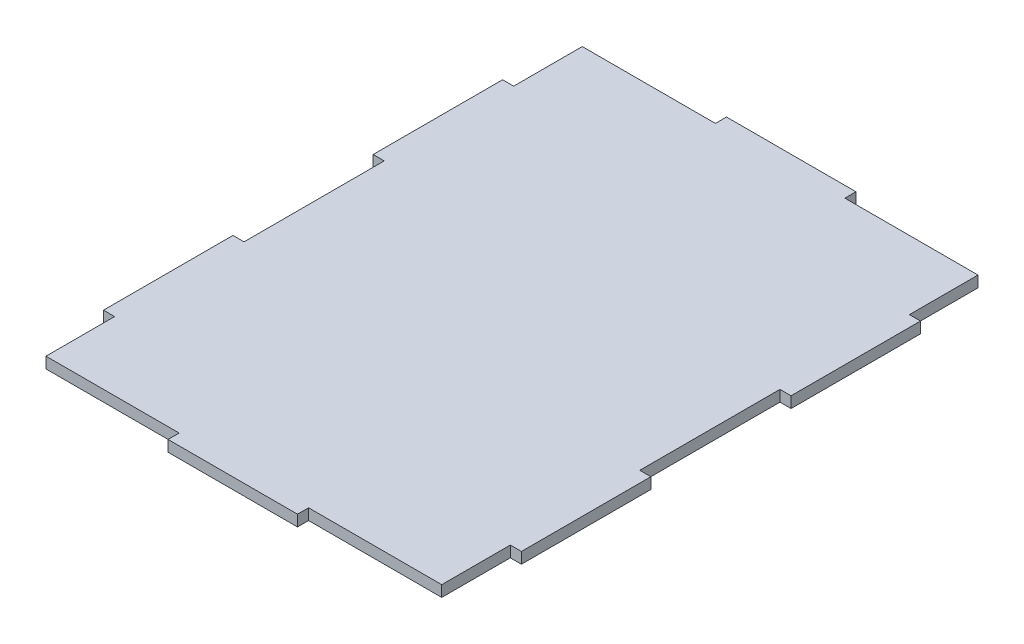
ISO-10303-21;
HEADER;
FILE_DESCRIPTION(('STEP AP214'),'2;1');
FILE_NAME('part.step','',(''),(''),'','','');
FILE_SCHEMA(('AUTOMOTIVE_DESIGN { 1 0 10303 214 1 1 1 1 }'));
ENDSEC;
DATA;
#1=APPLICATION_CONTEXT('core data for automotive mechanical design processes');
#2=APPLICATION_PROTOCOL_DEFINITION('international standard','automotive_design',2000,#1);
#3=PRODUCT_CONTEXT('',#1,'mechanical');
#4=PRODUCT('Part','Part','',(#3));
#5=PRODUCT_RELATED_PRODUCT_CATEGORY('part','',(#4));
#6=PRODUCT_DEFINITION_FORMATION('','',#4);
#7=PRODUCT_DEFINITION_CONTEXT('part definition',#1,'design');
#8=PRODUCT_DEFINITION('design','',#6,#7);
#9=PRODUCT_DEFINITION_SHAPE('','',#8);
#10=(LENGTH_UNIT() NAMED_UNIT(*) SI_UNIT(.MILLI.,.METRE.));
#11=(NAMED_UNIT(*) PLANE_ANGLE_UNIT() SI_UNIT($,.RADIAN.));
#12=(NAMED_UNIT(*) SI_UNIT($,.STERADIAN.) SOLID_ANGLE_UNIT());
#13=UNCERTAINTY_MEASURE_WITH_UNIT(LENGTH_MEASURE(1.E-05),#10,'distance_accuracy_value','');
#14=(GEOMETRIC_REPRESENTATION_CONTEXT(3) GLOBAL_UNCERTAINTY_ASSIGNED_CONTEXT((#13)) GLOBAL_UNIT_ASSIGNED_CONTEXT((#10,
#11,#12)) REPRESENTATION_CONTEXT('',''));
#15=CARTESIAN_POINT('',(0.,0.,0.));
#16=DIRECTION('',(0.,0.,1.));
#17=DIRECTION('',(1.,0.,0.));
#18=AXIS2_PLACEMENT_3D('',#15,#16,#17);
#19=CARTESIAN_POINT('',(56.5,3.,53.9535109118496));
#20=DIRECTION('',(0.,0.,-1.));
#21=DIRECTION('',(-1.,0.,0.));
#22=AXIS2_PLACEMENT_3D('',#19,#20,#21);
#23=PLANE('',#22);
#24=DIRECTION('',(0.,1.,0.));
#25=VECTOR('',#24,1.);
#26=CARTESIAN_POINT('',(53.5,3.,53.9535109118496));
#27=LINE('',#26,#25);
#28=CARTESIAN_POINT('',(53.5,0.,53.9535109118496));
#29=VERTEX_POINT('',#28);
#30=CARTESIAN_POINT('',(53.5,3.,53.9535109118496));
#31=VERTEX_POINT('',#30);
#32=EDGE_CURVE('E11',#29,#31,#27,.T.);
#33=ORIENTED_EDGE('',*,*,#32,.F.);
#34=DIRECTION('',(1.,0.,0.));
#35=VECTOR('',#34,1.);
#36=CARTESIAN_POINT('',(0.,0.,53.9535109118496));
#37=LINE('',#36,#35);
#38=CARTESIAN_POINT('',(56.5,0.,53.9535109118496));
#39=VERTEX_POINT('',#38);
#40=EDGE_CURVE('E168',#39,#29,#37,.F.);
#41=ORIENTED_EDGE('',*,*,#40,.F.);
#42=DIRECTION('',(0.,1.,0.));
#43=VECTOR('',#42,1.);
#44=CARTESIAN_POINT('',(56.5,3.,53.9535109118496));
#45=LINE('',#44,#43);
#46=CARTESIAN_POINT('',(56.5,3.,53.9535109118496));
#47=VERTEX_POINT('',#46);
#48=EDGE_CURVE('E50',#39,#47,#45,.T.);
#49=ORIENTED_EDGE('',*,*,#48,.T.);
#50=DIRECTION('',(-1.,0.,0.));
#51=VECTOR('',#50,1.);
#52=CARTESIAN_POINT('',(56.5,3.,53.9535109118496));
#53=LINE('',#52,#51);
#54=EDGE_CURVE('E326',#47,#31,#53,.T.);
#55=ORIENTED_EDGE('',*,*,#54,.T.);
#56=EDGE_LOOP('',(#33,#41,#49,#55));
#57=FACE_BOUND('',#56,.T.);
#58=ADVANCED_FACE('F41',(#57),#23,.F.);
#59=CARTESIAN_POINT('',(56.5,3.,53.9535109118496));
#60=DIRECTION('',(-1.,0.,0.));
#61=DIRECTION('',(0.,0.,1.));
#62=AXIS2_PLACEMENT_3D('',#59,#60,#61);
#63=PLANE('',#62);
#64=ORIENTED_EDGE('',*,*,#48,.F.);
#65=DIRECTION('',(0.,0.,1.));
#66=VECTOR('',#65,1.);
#67=CARTESIAN_POINT('',(56.5,0.,0.));
#68=LINE('',#67,#66);
#69=CARTESIAN_POINT('',(56.5,0.,18.9535109118496));
#70=VERTEX_POINT('',#69);
#71=EDGE_CURVE('E247',#70,#39,#68,.T.);
#72=ORIENTED_EDGE('',*,*,#71,.F.);
#73=DIRECTION('',(0.,1.,0.));
#74=VECTOR('',#73,1.);
#75=CARTESIAN_POINT('',(56.5,3.,18.9535109118496));
#76=LINE('',#75,#74);
#77=CARTESIAN_POINT('',(56.5,3.,18.9535109118496));
#78=VERTEX_POINT('',#77);
#79=EDGE_CURVE('E319',#70,#78,#76,.T.);
#80=ORIENTED_EDGE('',*,*,#79,.T.);
#81=DIRECTION('',(0.,0.,1.));
#82=VECTOR('',#81,1.);
#83=CARTESIAN_POINT('',(56.5,3.,53.9535109118496));
#84=LINE('',#83,#82);
#85=EDGE_CURVE('E336',#78,#47,#84,.T.);
#86=ORIENTED_EDGE('',*,*,#85,.T.);
#87=EDGE_LOOP('',(#64,#72,#80,#86));
#88=FACE_BOUND('',#87,.T.);
#89=ADVANCED_FACE('F339',(#88),#63,.F.);
#90=CARTESIAN_POINT('',(56.5,3.,18.9535109118496));
#91=DIRECTION('',(0.,0.,-1.));
#92=DIRECTION('',(-1.,0.,0.));
#93=AXIS2_PLACEMENT_3D('',#90,#91,#92);
#94=PLANE('',#93);
#95=ORIENTED_EDGE('',*,*,#79,.F.);
#96=DIRECTION('',(1.,0.,0.));
#97=VECTOR('',#96,1.);
#98=CARTESIAN_POINT('',(0.,0.,18.9535109118496));
#99=LINE('',#98,#97);
#100=CARTESIAN_POINT('',(53.5,0.,18.9535109118496));
#101=VERTEX_POINT('',#100);
#102=EDGE_CURVE('E244',#70,#101,#99,.F.);
#103=ORIENTED_EDGE('',*,*,#102,.T.);
#104=DIRECTION('',(0.,1.,0.));
#105=VECTOR('',#104,1.);
#106=CARTESIAN_POINT('',(53.5,3.,18.9535109118496));
#107=LINE('',#106,#105);
#108=CARTESIAN_POINT('',(53.5,3.,18.9535109118496));
#109=VERTEX_POINT('',#108);
#110=EDGE_CURVE('E316',#101,#109,#107,.T.);
#111=ORIENTED_EDGE('',*,*,#110,.T.);
#112=DIRECTION('',(-1.,0.,0.));
#113=VECTOR('',#112,1.);
#114=CARTESIAN_POINT('',(56.5,3.,18.9535109118496));
#115=LINE('',#114,#113);
#116=EDGE_CURVE('E340',#78,#109,#115,.T.);
#117=ORIENTED_EDGE('',*,*,#116,.F.);
#118=EDGE_LOOP('',(#95,#103,#111,#117));
#119=FACE_BOUND('',#118,.T.);
#120=ADVANCED_FACE('F554',(#119),#94,.T.);
#121=CARTESIAN_POINT('',(53.5,3.,-72.5));
#122=DIRECTION('',(-1.,0.,0.));
#123=DIRECTION('',(0.,0.,1.));
#124=AXIS2_PLACEMENT_3D('',#121,#122,#123);
#125=PLANE('',#124);
#126=ORIENTED_EDGE('',*,*,#110,.F.);
#127=DIRECTION('',(0.,0.,1.));
#128=VECTOR('',#127,1.);
#129=CARTESIAN_POINT('',(53.5,0.,0.));
#130=LINE('',#129,#128);
#131=CARTESIAN_POINT('',(53.5,0.,-18.9535109118496));
#132=VERTEX_POINT('',#131);
#133=EDGE_CURVE('E241',#132,#101,#130,.T.);
#134=ORIENTED_EDGE('',*,*,#133,.F.);
#135=DIRECTION('',(0.,1.,0.));
#136=VECTOR('',#135,1.);
#137=CARTESIAN_POINT('',(53.5,3.,-18.9535109118496));
#138=LINE('',#137,#136);
#139=CARTESIAN_POINT('',(53.5,3.,-18.9535109118496));
#140=VERTEX_POINT('',#139);
#141=EDGE_CURVE('E313',#132,#140,#138,.T.);
#142=ORIENTED_EDGE('',*,*,#141,.T.);
#143=DIRECTION('',(0.,0.,1.));
#144=VECTOR('',#143,1.);
#145=CARTESIAN_POINT('',(53.5,3.,-72.5));
#146=LINE('',#145,#144);
#147=EDGE_CURVE('E342',#140,#109,#146,.T.);
#148=ORIENTED_EDGE('',*,*,#147,.T.);
#149=EDGE_LOOP('',(#126,#134,#142,#148));
#150=FACE_BOUND('',#149,.T.);
#151=ADVANCED_FACE('F423',(#150),#125,.F.);
#152=CARTESIAN_POINT('',(56.5,3.,-18.9535109118496));
#153=DIRECTION('',(0.,0.,-1.));
#154=DIRECTION('',(-1.,0.,0.));
#155=AXIS2_PLACEMENT_3D('',#152,#153,#154);
#156=PLANE('',#155);
#157=ORIENTED_EDGE('',*,*,#141,.F.);
#158=DIRECTION('',(1.,0.,0.));
#159=VECTOR('',#158,1.);
#160=CARTESIAN_POINT('',(0.,0.,-18.9535109118496));
#161=LINE('',#160,#159);
#162=CARTESIAN_POINT('',(56.5,0.,-18.9535109118496));
#163=VERTEX_POINT('',#162);
#164=EDGE_CURVE('E238',#163,#132,#161,.F.);
#165=ORIENTED_EDGE('',*,*,#164,.F.);
#166=DIRECTION('',(0.,1.,0.));
#167=VECTOR('',#166,1.);
#168=CARTESIAN_POINT('',(56.5,3.,-18.9535109118496));
#169=LINE('',#168,#167);
#170=CARTESIAN_POINT('',(56.5,3.,-18.9535109118496));
#171=VERTEX_POINT('',#170);
#172=EDGE_CURVE('E310',#163,#171,#169,.T.);
#173=ORIENTED_EDGE('',*,*,#172,.T.);
#174=DIRECTION('',(-1.,0.,0.));
#175=VECTOR('',#174,1.);
#176=CARTESIAN_POINT('',(56.5,3.,-18.9535109118496));
#177=LINE('',#176,#175);
#178=EDGE_CURVE('E346',#171,#140,#177,.T.);
#179=ORIENTED_EDGE('',*,*,#178,.T.);
#180=EDGE_LOOP('',(#157,#165,#173,#179));
#181=FACE_BOUND('',#180,.T.);
#182=ADVANCED_FACE('F432',(#181),#156,.F.);
#183=CARTESIAN_POINT('',(56.5,3.,-53.9535109118496));
#184=DIRECTION('',(-1.,0.,0.));
#185=DIRECTION('',(0.,0.,1.));
#186=AXIS2_PLACEMENT_3D('',#183,#184,#185);
#187=PLANE('',#186);
#188=ORIENTED_EDGE('',*,*,#172,.F.);
#189=DIRECTION('',(0.,0.,1.));
#190=VECTOR('',#189,1.);
#191=CARTESIAN_POINT('',(56.5,0.,0.));
#192=LINE('',#191,#190);
#193=CARTESIAN_POINT('',(56.5,0.,-53.9535109118496));
#194=VERTEX_POINT('',#193);
#195=EDGE_CURVE('E235',#194,#163,#192,.T.);
#196=ORIENTED_EDGE('',*,*,#195,.F.);
#197=DIRECTION('',(0.,1.,0.));
#198=VECTOR('',#197,1.);
#199=CARTESIAN_POINT('',(56.5,3.,-53.9535109118496));
#200=LINE('',#199,#198);
#201=CARTESIAN_POINT('',(56.5,3.,-53.9535109118496));
#202=VERTEX_POINT('',#201);
#203=EDGE_CURVE('E307',#194,#202,#200,.T.);
#204=ORIENTED_EDGE('',*,*,#203,.T.);
#205=DIRECTION('',(0.,0.,1.));
#206=VECTOR('',#205,1.);
#207=CARTESIAN_POINT('',(56.5,3.,-53.9535109118496));
#208=LINE('',#207,#206);
#209=EDGE_CURVE('E349',#202,#171,#208,.T.);
#210=ORIENTED_EDGE('',*,*,#209,.T.);
#211=EDGE_LOOP('',(#188,#196,#204,#210));
#212=FACE_BOUND('',#211,.T.);
#213=ADVANCED_FACE('F438',(#212),#187,.F.);
#214=CARTESIAN_POINT('',(56.5,3.,-53.9535109118496));
#215=DIRECTION('',(0.,0.,-1.));
#216=DIRECTION('',(-1.,0.,0.));
#217=AXIS2_PLACEMENT_3D('',#214,#215,#216);
#218=PLANE('',#217);
#219=ORIENTED_EDGE('',*,*,#203,.F.);
#220=DIRECTION('',(1.,0.,0.));
#221=VECTOR('',#220,1.);
#222=CARTESIAN_POINT('',(0.,0.,-53.9535109118496));
#223=LINE('',#222,#221);
#224=CARTESIAN_POINT('',(53.5,0.,-53.9535109118496));
#225=VERTEX_POINT('',#224);
#226=EDGE_CURVE('E232',#194,#225,#223,.F.);
#227=ORIENTED_EDGE('',*,*,#226,.T.);
#228=DIRECTION('',(0.,1.,0.));
#229=VECTOR('',#228,1.);
#230=CARTESIAN_POINT('',(53.5,3.,-53.9535109118496));
#231=LINE('',#230,#229);
#232=CARTESIAN_POINT('',(53.5,3.,-53.9535109118496));
#233=VERTEX_POINT('',#232);
#234=EDGE_CURVE('E304',#225,#233,#231,.T.);
#235=ORIENTED_EDGE('',*,*,#234,.T.);
#236=DIRECTION('',(-1.,0.,0.));
#237=VECTOR('',#236,1.);
#238=CARTESIAN_POINT('',(56.5,3.,-53.9535109118496));
#239=LINE('',#238,#237);
#240=EDGE_CURVE('E352',#202,#233,#239,.T.);
#241=ORIENTED_EDGE('',*,*,#240,.F.);
#242=EDGE_LOOP('',(#219,#227,#235,#241));
#243=FACE_BOUND('',#242,.T.);
#244=ADVANCED_FACE('F443',(#243),#218,.T.);
#245=ORIENTED_EDGE('',*,*,#234,.F.);
#246=DIRECTION('',(0.,0.,1.));
#247=VECTOR('',#246,1.);
#248=CARTESIAN_POINT('',(53.5,0.,0.));
#249=LINE('',#248,#247);
#250=CARTESIAN_POINT('',(53.5,0.,-72.5));
#251=VERTEX_POINT('',#250);
#252=EDGE_CURVE('E229',#251,#225,#249,.T.);
#253=ORIENTED_EDGE('',*,*,#252,.F.);
#254=DIRECTION('',(0.,1.,0.));
#255=VECTOR('',#254,1.);
#256=CARTESIAN_POINT('',(53.5,3.,-72.5));
#257=LINE('',#256,#255);
#258=CARTESIAN_POINT('',(53.5,3.,-72.5));
#259=VERTEX_POINT('',#258);
#260=EDGE_CURVE('E301',#251,#259,#257,.T.);
#261=ORIENTED_EDGE('',*,*,#260,.T.);
#262=EDGE_CURVE('E355',#259,#233,#146,.T.);
#263=ORIENTED_EDGE('',*,*,#262,.T.);
#264=EDGE_LOOP('',(#245,#253,#261,#263));
#265=FACE_BOUND('',#264,.T.);
#266=ADVANCED_FACE('F452',(#265),#125,.F.);
#267=CARTESIAN_POINT('',(53.5,3.,-72.5));
#268=DIRECTION('',(0.,0.,-1.));
#269=DIRECTION('',(-1.,0.,0.));
#270=AXIS2_PLACEMENT_3D('',#267,#268,#269);
#271=PLANE('',#270);
#272=ORIENTED_EDGE('',*,*,#260,.F.);
#273=DIRECTION('',(1.,0.,0.));
#274=VECTOR('',#273,1.);
#275=CARTESIAN_POINT('',(0.,0.,-72.5));
#276=LINE('',#275,#274);
#277=CARTESIAN_POINT('',(17.5,0.,-72.5));
#278=VERTEX_POINT('',#277);
#279=EDGE_CURVE('E226',#251,#278,#276,.F.);
#280=ORIENTED_EDGE('',*,*,#279,.T.);
#281=DIRECTION('',(0.,1.,0.));
#282=VECTOR('',#281,1.);
#283=CARTESIAN_POINT('',(17.5,3.,-72.5));
#284=LINE('',#283,#282);
#285=CARTESIAN_POINT('',(17.5,3.,-72.5));
#286=VERTEX_POINT('',#285);
#287=EDGE_CURVE('E298',#278,#286,#284,.T.);
#288=ORIENTED_EDGE('',*,*,#287,.T.);
#289=DIRECTION('',(-1.,0.,0.));
#290=VECTOR('',#289,1.);
#291=CARTESIAN_POINT('',(53.5,3.,-72.5));
#292=LINE('',#291,#290);
#293=EDGE_CURVE('E356',#259,#286,#292,.T.);
#294=ORIENTED_EDGE('',*,*,#293,.F.);
#295=EDGE_LOOP('',(#272,#280,#288,#294));
#296=FACE_BOUND('',#295,.T.);
#297=ADVANCED_FACE('F456',(#296),#271,.T.);
#298=CARTESIAN_POINT('',(17.5,3.,-75.5));
#299=DIRECTION('',(-1.,0.,0.));
#300=DIRECTION('',(0.,0.,1.));
#301=AXIS2_PLACEMENT_3D('',#298,#299,#300);
#302=PLANE('',#301);
#303=ORIENTED_EDGE('',*,*,#287,.F.);
#304=DIRECTION('',(0.,0.,1.));
#305=VECTOR('',#304,1.);
#306=CARTESIAN_POINT('',(17.5,0.,0.));
#307=LINE('',#306,#305);
#308=CARTESIAN_POINT('',(17.5,0.,-75.5));
#309=VERTEX_POINT('',#308);
#310=EDGE_CURVE('E223',#309,#278,#307,.T.);
#311=ORIENTED_EDGE('',*,*,#310,.F.);
#312=DIRECTION('',(0.,1.,0.));
#313=VECTOR('',#312,1.);
#314=CARTESIAN_POINT('',(17.5,3.,-75.5));
#315=LINE('',#314,#313);
#316=CARTESIAN_POINT('',(17.5,3.,-75.5));
#317=VERTEX_POINT('',#316);
#318=EDGE_CURVE('E295',#309,#317,#315,.T.);
#319=ORIENTED_EDGE('',*,*,#318,.T.);
#320=DIRECTION('',(0.,0.,1.));
#321=VECTOR('',#320,1.);
#322=CARTESIAN_POINT('',(17.5,3.,-75.5));
#323=LINE('',#322,#321);
#324=EDGE_CURVE('E359',#317,#286,#323,.T.);
#325=ORIENTED_EDGE('',*,*,#324,.T.);
#326=EDGE_LOOP('',(#303,#311,#319,#325));
#327=FACE_BOUND('',#326,.T.);
#328=ADVANCED_FACE('F461',(#327),#302,.F.);
#329=CARTESIAN_POINT('',(17.5,3.,-75.5));
#330=DIRECTION('',(0.,0.,1.));
#331=DIRECTION('',(1.,0.,0.));
#332=AXIS2_PLACEMENT_3D('',#329,#330,#331);
#333=PLANE('',#332);
#334=ORIENTED_EDGE('',*,*,#318,.F.);
#335=DIRECTION('',(1.,0.,0.));
#336=VECTOR('',#335,1.);
#337=CARTESIAN_POINT('',(0.,0.,-75.5));
#338=LINE('',#337,#336);
#339=CARTESIAN_POINT('',(-17.5,0.,-75.5));
#340=VERTEX_POINT('',#339);
#341=EDGE_CURVE('E220',#340,#309,#338,.T.);
#342=ORIENTED_EDGE('',*,*,#341,.F.);
#343=DIRECTION('',(0.,1.,0.));
#344=VECTOR('',#343,1.);
#345=CARTESIAN_POINT('',(-17.5,3.,-75.5));
#346=LINE('',#345,#344);
#347=CARTESIAN_POINT('',(-17.5,3.,-75.5));
#348=VERTEX_POINT('',#347);
#349=EDGE_CURVE('E292',#340,#348,#346,.T.);
#350=ORIENTED_EDGE('',*,*,#349,.T.);
#351=DIRECTION('',(1.,0.,0.));
#352=VECTOR('',#351,1.);
#353=CARTESIAN_POINT('',(17.5,3.,-75.5));
#354=LINE('',#353,#352);
#355=EDGE_CURVE('E363',#348,#317,#354,.T.);
#356=ORIENTED_EDGE('',*,*,#355,.T.);
#357=EDGE_LOOP('',(#334,#342,#350,#356));
#358=FACE_BOUND('',#357,.T.);
#359=ADVANCED_FACE('F470',(#358),#333,.F.);
#360=CARTESIAN_POINT('',(-17.5,3.,-75.5));
#361=DIRECTION('',(-1.,0.,0.));
#362=DIRECTION('',(0.,0.,1.));
#363=AXIS2_PLACEMENT_3D('',#360,#361,#362);
#364=PLANE('',#363);
#365=ORIENTED_EDGE('',*,*,#349,.F.);
#366=DIRECTION('',(0.,0.,1.));
#367=VECTOR('',#366,1.);
#368=CARTESIAN_POINT('',(-17.5,0.,0.));
#369=LINE('',#368,#367);
#370=CARTESIAN_POINT('',(-17.5,0.,-72.5));
#371=VERTEX_POINT('',#370);
#372=EDGE_CURVE('E217',#340,#371,#369,.T.);
#373=ORIENTED_EDGE('',*,*,#372,.T.);
#374=DIRECTION('',(0.,1.,0.));
#375=VECTOR('',#374,1.);
#376=CARTESIAN_POINT('',(-17.5,3.,-72.5));
#377=LINE('',#376,#375);
#378=CARTESIAN_POINT('',(-17.5,3.,-72.5));
#379=VERTEX_POINT('',#378);
#380=EDGE_CURVE('E289',#371,#379,#377,.T.);
#381=ORIENTED_EDGE('',*,*,#380,.T.);
#382=DIRECTION('',(0.,0.,1.));
#383=VECTOR('',#382,1.);
#384=CARTESIAN_POINT('',(-17.5,3.,-75.5));
#385=LINE('',#384,#383);
#386=EDGE_CURVE('E366',#348,#379,#385,.T.);
#387=ORIENTED_EDGE('',*,*,#386,.F.);
#388=EDGE_LOOP('',(#365,#373,#381,#387));
#389=FACE_BOUND('',#388,.T.);
#390=ADVANCED_FACE('F474',(#389),#364,.T.);
#391=ORIENTED_EDGE('',*,*,#380,.F.);
#392=DIRECTION('',(1.,0.,0.));
#393=VECTOR('',#392,1.);
#394=CARTESIAN_POINT('',(0.,0.,-72.5));
#395=LINE('',#394,#393);
#396=CARTESIAN_POINT('',(-53.5,0.,-72.5));
#397=VERTEX_POINT('',#396);
#398=EDGE_CURVE('E214',#371,#397,#395,.F.);
#399=ORIENTED_EDGE('',*,*,#398,.T.);
#400=DIRECTION('',(0.,1.,0.));
#401=VECTOR('',#400,1.);
#402=CARTESIAN_POINT('',(-53.5,3.,-72.5));
#403=LINE('',#402,#401);
#404=CARTESIAN_POINT('',(-53.5,3.,-72.5));
#405=VERTEX_POINT('',#404);
#406=EDGE_CURVE('E286',#397,#405,#403,.T.);
#407=ORIENTED_EDGE('',*,*,#406,.T.);
#408=EDGE_CURVE('E360',#379,#405,#292,.T.);
#409=ORIENTED_EDGE('',*,*,#408,.F.);
#410=EDGE_LOOP('',(#391,#399,#407,#409));
#411=FACE_BOUND('',#410,.T.);
#412=ADVANCED_FACE('F478',(#411),#271,.T.);
#413=CARTESIAN_POINT('',(-53.5,3.,-72.5));
#414=DIRECTION('',(-1.,0.,0.));
#415=DIRECTION('',(0.,0.,1.));
#416=AXIS2_PLACEMENT_3D('',#413,#414,#415);
#417=PLANE('',#416);
#418=ORIENTED_EDGE('',*,*,#406,.F.);
#419=DIRECTION('',(0.,0.,1.));
#420=VECTOR('',#419,1.);
#421=CARTESIAN_POINT('',(-53.5,0.,0.));
#422=LINE('',#421,#420);
#423=CARTESIAN_POINT('',(-53.5,0.,-53.95));
#424=VERTEX_POINT('',#423);
#425=EDGE_CURVE('E211',#397,#424,#422,.T.);
#426=ORIENTED_EDGE('',*,*,#425,.T.);
#427=DIRECTION('',(0.,1.,0.));
#428=VECTOR('',#427,1.);
#429=CARTESIAN_POINT('',(-53.5,3.,-53.95));
#430=LINE('',#429,#428);
#431=CARTESIAN_POINT('',(-53.5,3.,-53.95));
#432=VERTEX_POINT('',#431);
#433=EDGE_CURVE('E283',#424,#432,#430,.T.);
#434=ORIENTED_EDGE('',*,*,#433,.T.);
#435=DIRECTION('',(0.,0.,1.));
#436=VECTOR('',#435,1.);
#437=CARTESIAN_POINT('',(-53.5,3.,-72.5));
#438=LINE('',#437,#436);
#439=EDGE_CURVE('E369',#405,#432,#438,.T.);
#440=ORIENTED_EDGE('',*,*,#439,.F.);
#441=EDGE_LOOP('',(#418,#426,#434,#440));
#442=FACE_BOUND('',#441,.T.);
#443=ADVANCED_FACE('F488',(#442),#417,.T.);
#444=CARTESIAN_POINT('',(-56.5,3.,-53.95));
#445=DIRECTION('',(0.,0.,1.));
#446=DIRECTION('',(1.,0.,0.));
#447=AXIS2_PLACEMENT_3D('',#444,#445,#446);
#448=PLANE('',#447);
#449=ORIENTED_EDGE('',*,*,#433,.F.);
#450=DIRECTION('',(1.,0.,0.));
#451=VECTOR('',#450,1.);
#452=CARTESIAN_POINT('',(0.,0.,-53.95));
#453=LINE('',#452,#451);
#454=CARTESIAN_POINT('',(-56.5,0.,-53.95));
#455=VERTEX_POINT('',#454);
#456=EDGE_CURVE('E208',#455,#424,#453,.T.);
#457=ORIENTED_EDGE('',*,*,#456,.F.);
#458=DIRECTION('',(0.,1.,0.));
#459=VECTOR('',#458,1.);
#460=CARTESIAN_POINT('',(-56.5,3.,-53.95));
#461=LINE('',#460,#459);
#462=CARTESIAN_POINT('',(-56.5,3.,-53.95));
#463=VERTEX_POINT('',#462);
#464=EDGE_CURVE('E280',#455,#463,#461,.T.);
#465=ORIENTED_EDGE('',*,*,#464,.T.);
#466=DIRECTION('',(1.,0.,0.));
#467=VECTOR('',#466,1.);
#468=CARTESIAN_POINT('',(-56.5,3.,-53.95));
#469=LINE('',#468,#467);
#470=EDGE_CURVE('E372',#463,#432,#469,.T.);
#471=ORIENTED_EDGE('',*,*,#470,.T.);
#472=EDGE_LOOP('',(#449,#457,#465,#471));
#473=FACE_BOUND('',#472,.T.);
#474=ADVANCED_FACE('F493',(#473),#448,.F.);
#475=CARTESIAN_POINT('',(-56.5,3.,-53.95));
#476=DIRECTION('',(1.,0.,0.));
#477=DIRECTION('',(0.,0.,-1.));
#478=AXIS2_PLACEMENT_3D('',#475,#476,#477);
#479=PLANE('',#478);
#480=ORIENTED_EDGE('',*,*,#464,.F.);
#481=DIRECTION('',(0.,0.,1.));
#482=VECTOR('',#481,1.);
#483=CARTESIAN_POINT('',(-56.5,0.,0.));
#484=LINE('',#483,#482);
#485=CARTESIAN_POINT('',(-56.5,0.,-18.95));
#486=VERTEX_POINT('',#485);
#487=EDGE_CURVE('E205',#486,#455,#484,.F.);
#488=ORIENTED_EDGE('',*,*,#487,.F.);
#489=DIRECTION('',(0.,1.,0.));
#490=VECTOR('',#489,1.);
#491=CARTESIAN_POINT('',(-56.5,3.,-18.95));
#492=LINE('',#491,#490);
#493=CARTESIAN_POINT('',(-56.5,3.,-18.95));
#494=VERTEX_POINT('',#493);
#495=EDGE_CURVE('E277',#486,#494,#492,.T.);
#496=ORIENTED_EDGE('',*,*,#495,.T.);
#497=DIRECTION('',(0.,0.,-1.));
#498=VECTOR('',#497,1.);
#499=CARTESIAN_POINT('',(-56.5,3.,-53.95));
#500=LINE('',#499,#498);
#501=EDGE_CURVE('E377',#494,#463,#500,.T.);
#502=ORIENTED_EDGE('',*,*,#501,.T.);
#503=EDGE_LOOP('',(#480,#488,#496,#502));
#504=FACE_BOUND('',#503,.T.);
#505=ADVANCED_FACE('F498',(#504),#479,.F.);
#506=CARTESIAN_POINT('',(-56.5,3.,-18.95));
#507=DIRECTION('',(0.,0.,1.));
#508=DIRECTION('',(1.,0.,0.));
#509=AXIS2_PLACEMENT_3D('',#506,#507,#508);
#510=PLANE('',#509);
#511=ORIENTED_EDGE('',*,*,#495,.F.);
#512=DIRECTION('',(1.,0.,0.));
#513=VECTOR('',#512,1.);
#514=CARTESIAN_POINT('',(0.,0.,-18.95));
#515=LINE('',#514,#513);
#516=CARTESIAN_POINT('',(-53.5,0.,-18.95));
#517=VERTEX_POINT('',#516);
#518=EDGE_CURVE('E202',#486,#517,#515,.T.);
#519=ORIENTED_EDGE('',*,*,#518,.T.);
#520=DIRECTION('',(0.,1.,0.));
#521=VECTOR('',#520,1.);
#522=CARTESIAN_POINT('',(-53.5,3.,-18.95));
#523=LINE('',#522,#521);
#524=CARTESIAN_POINT('',(-53.5,3.,-18.95));
#525=VERTEX_POINT('',#524);
#526=EDGE_CURVE('E274',#517,#525,#523,.T.);
#527=ORIENTED_EDGE('',*,*,#526,.T.);
#528=DIRECTION('',(1.,0.,0.));
#529=VECTOR('',#528,1.);
#530=CARTESIAN_POINT('',(-56.5,3.,-18.95));
#531=LINE('',#530,#529);
#532=EDGE_CURVE('E380',#494,#525,#531,.T.);
#533=ORIENTED_EDGE('',*,*,#532,.F.);
#534=EDGE_LOOP('',(#511,#519,#527,#533));
#535=FACE_BOUND('',#534,.T.);
#536=ADVANCED_FACE('F508',(#535),#510,.T.);
#537=ORIENTED_EDGE('',*,*,#526,.F.);
#538=DIRECTION('',(0.,0.,1.));
#539=VECTOR('',#538,1.);
#540=CARTESIAN_POINT('',(-53.5,0.,0.));
#541=LINE('',#540,#539);
#542=CARTESIAN_POINT('',(-53.5,0.,18.95));
#543=VERTEX_POINT('',#542);
#544=EDGE_CURVE('E199',#517,#543,#541,.T.);
#545=ORIENTED_EDGE('',*,*,#544,.T.);
#546=DIRECTION('',(0.,1.,0.));
#547=VECTOR('',#546,1.);
#548=CARTESIAN_POINT('',(-53.5,3.,18.95));
#549=LINE('',#548,#547);
#550=CARTESIAN_POINT('',(-53.5,3.,18.95));
#551=VERTEX_POINT('',#550);
#552=EDGE_CURVE('E271',#543,#551,#549,.T.);
#553=ORIENTED_EDGE('',*,*,#552,.T.);
#554=EDGE_CURVE('E374',#525,#551,#438,.T.);
#555=ORIENTED_EDGE('',*,*,#554,.F.);
#556=EDGE_LOOP('',(#537,#545,#553,#555));
#557=FACE_BOUND('',#556,.T.);
#558=ADVANCED_FACE('F512',(#557),#417,.T.);
#559=CARTESIAN_POINT('',(-56.5,3.,18.95));
#560=DIRECTION('',(0.,0.,1.));
#561=DIRECTION('',(1.,0.,0.));
#562=AXIS2_PLACEMENT_3D('',#559,#560,#561);
#563=PLANE('',#562);
#564=ORIENTED_EDGE('',*,*,#552,.F.);
#565=DIRECTION('',(1.,0.,0.));
#566=VECTOR('',#565,1.);
#567=CARTESIAN_POINT('',(0.,0.,18.95));
#568=LINE('',#567,#566);
#569=CARTESIAN_POINT('',(-56.5,0.,18.95));
#570=VERTEX_POINT('',#569);
#571=EDGE_CURVE('E196',#570,#543,#568,.T.);
#572=ORIENTED_EDGE('',*,*,#571,.F.);
#573=DIRECTION('',(0.,1.,0.));
#574=VECTOR('',#573,1.);
#575=CARTESIAN_POINT('',(-56.5,3.,18.95));
#576=LINE('',#575,#574);
#577=CARTESIAN_POINT('',(-56.5,3.,18.95));
#578=VERTEX_POINT('',#577);
#579=EDGE_CURVE('E268',#570,#578,#576,.T.);
#580=ORIENTED_EDGE('',*,*,#579,.T.);
#581=DIRECTION('',(1.,0.,0.));
#582=VECTOR('',#581,1.);
#583=CARTESIAN_POINT('',(-56.5,3.,18.95));
#584=LINE('',#583,#582);
#585=EDGE_CURVE('E383',#578,#551,#584,.T.);
#586=ORIENTED_EDGE('',*,*,#585,.T.);
#587=EDGE_LOOP('',(#564,#572,#580,#586));
#588=FACE_BOUND('',#587,.T.);
#589=ADVANCED_FACE('F517',(#588),#563,.F.);
#590=CARTESIAN_POINT('',(-56.5,3.,53.95));
#591=DIRECTION('',(1.,0.,0.));
#592=DIRECTION('',(0.,0.,-1.));
#593=AXIS2_PLACEMENT_3D('',#590,#591,#592);
#594=PLANE('',#593);
#595=ORIENTED_EDGE('',*,*,#579,.F.);
#596=DIRECTION('',(0.,0.,1.));
#597=VECTOR('',#596,1.);
#598=CARTESIAN_POINT('',(-56.5,0.,0.));
#599=LINE('',#598,#597);
#600=CARTESIAN_POINT('',(-56.5,0.,53.95));
#601=VERTEX_POINT('',#600);
#602=EDGE_CURVE('E193',#601,#570,#599,.F.);
#603=ORIENTED_EDGE('',*,*,#602,.F.);
#604=DIRECTION('',(0.,1.,0.));
#605=VECTOR('',#604,1.);
#606=CARTESIAN_POINT('',(-56.5,3.,53.95));
#607=LINE('',#606,#605);
#608=CARTESIAN_POINT('',(-56.5,3.,53.95));
#609=VERTEX_POINT('',#608);
#610=EDGE_CURVE('E265',#601,#609,#607,.T.);
#611=ORIENTED_EDGE('',*,*,#610,.T.);
#612=DIRECTION('',(0.,0.,-1.));
#613=VECTOR('',#612,1.);
#614=CARTESIAN_POINT('',(-56.5,3.,53.95));
#615=LINE('',#614,#613);
#616=EDGE_CURVE('E386',#609,#578,#615,.T.);
#617=ORIENTED_EDGE('',*,*,#616,.T.);
#618=EDGE_LOOP('',(#595,#603,#611,#617));
#619=FACE_BOUND('',#618,.T.);
#620=ADVANCED_FACE('F526',(#619),#594,.F.);
#621=CARTESIAN_POINT('',(-56.5,3.,53.95));
#622=DIRECTION('',(0.,0.,1.));
#623=DIRECTION('',(1.,0.,0.));
#624=AXIS2_PLACEMENT_3D('',#621,#622,#623);
#625=PLANE('',#624);
#626=ORIENTED_EDGE('',*,*,#610,.F.);
#627=DIRECTION('',(1.,0.,0.));
#628=VECTOR('',#627,1.);
#629=CARTESIAN_POINT('',(0.,0.,53.95));
#630=LINE('',#629,#628);
#631=CARTESIAN_POINT('',(-53.5,0.,53.95));
#632=VERTEX_POINT('',#631);
#633=EDGE_CURVE('E190',#601,#632,#630,.T.);
#634=ORIENTED_EDGE('',*,*,#633,.T.);
#635=DIRECTION('',(0.,1.,0.));
#636=VECTOR('',#635,1.);
#637=CARTESIAN_POINT('',(-53.5,3.,53.95));
#638=LINE('',#637,#636);
#639=CARTESIAN_POINT('',(-53.5,3.,53.95));
#640=VERTEX_POINT('',#639);
#641=EDGE_CURVE('E262',#632,#640,#638,.T.);
#642=ORIENTED_EDGE('',*,*,#641,.T.);
#643=DIRECTION('',(1.,0.,0.));
#644=VECTOR('',#643,1.);
#645=CARTESIAN_POINT('',(-56.5,3.,53.95));
#646=LINE('',#645,#644);
#647=EDGE_CURVE('E389',#609,#640,#646,.T.);
#648=ORIENTED_EDGE('',*,*,#647,.F.);
#649=EDGE_LOOP('',(#626,#634,#642,#648));
#650=FACE_BOUND('',#649,.T.);
#651=ADVANCED_FACE('F530',(#650),#625,.T.);
#652=ORIENTED_EDGE('',*,*,#641,.F.);
#653=DIRECTION('',(0.,0.,1.));
#654=VECTOR('',#653,1.);
#655=CARTESIAN_POINT('',(-53.5,0.,0.));
#656=LINE('',#655,#654);
#657=CARTESIAN_POINT('',(-53.5,0.,72.5));
#658=VERTEX_POINT('',#657);
#659=EDGE_CURVE('E187',#632,#658,#656,.T.);
#660=ORIENTED_EDGE('',*,*,#659,.T.);
#661=DIRECTION('',(0.,1.,0.));
#662=VECTOR('',#661,1.);
#663=CARTESIAN_POINT('',(-53.5,3.,72.5));
#664=LINE('',#663,#662);
#665=CARTESIAN_POINT('',(-53.5,3.,72.5));
#666=VERTEX_POINT('',#665);
#667=EDGE_CURVE('E259',#658,#666,#664,.T.);
#668=ORIENTED_EDGE('',*,*,#667,.T.);
#669=EDGE_CURVE('E373',#640,#666,#438,.T.);
#670=ORIENTED_EDGE('',*,*,#669,.F.);
#671=EDGE_LOOP('',(#652,#660,#668,#670));
#672=FACE_BOUND('',#671,.T.);
#673=ADVANCED_FACE('F533',(#672),#417,.T.);
#674=CARTESIAN_POINT('',(53.5,3.,72.5));
#675=DIRECTION('',(0.,0.,-1.));
#676=DIRECTION('',(-1.,0.,0.));
#677=AXIS2_PLACEMENT_3D('',#674,#675,#676);
#678=PLANE('',#677);
#679=ORIENTED_EDGE('',*,*,#667,.F.);
#680=DIRECTION('',(1.,0.,0.));
#681=VECTOR('',#680,1.);
#682=CARTESIAN_POINT('',(0.,0.,72.5));
#683=LINE('',#682,#681);
#684=CARTESIAN_POINT('',(-17.5,0.,72.5));
#685=VERTEX_POINT('',#684);
#686=EDGE_CURVE('E184',#685,#658,#683,.F.);
#687=ORIENTED_EDGE('',*,*,#686,.F.);
#688=DIRECTION('',(0.,1.,0.));
#689=VECTOR('',#688,1.);
#690=CARTESIAN_POINT('',(-17.5,3.,72.5));
#691=LINE('',#690,#689);
#692=CARTESIAN_POINT('',(-17.5,3.,72.5));
#693=VERTEX_POINT('',#692);
#694=EDGE_CURVE('E256',#685,#693,#691,.T.);
#695=ORIENTED_EDGE('',*,*,#694,.T.);
#696=DIRECTION('',(-1.,0.,0.));
#697=VECTOR('',#696,1.);
#698=CARTESIAN_POINT('',(53.5,3.,72.5));
#699=LINE('',#698,#697);
#700=EDGE_CURVE('E395',#693,#666,#699,.T.);
#701=ORIENTED_EDGE('',*,*,#700,.T.);
#702=EDGE_LOOP('',(#679,#687,#695,#701));
#703=FACE_BOUND('',#702,.T.);
#704=ADVANCED_FACE('F412',(#703),#678,.F.);
#705=CARTESIAN_POINT('',(-17.5,3.,75.5));
#706=DIRECTION('',(1.,0.,0.));
#707=DIRECTION('',(0.,0.,-1.));
#708=AXIS2_PLACEMENT_3D('',#705,#706,#707);
#709=PLANE('',#708);
#710=ORIENTED_EDGE('',*,*,#694,.F.);
#711=DIRECTION('',(0.,0.,1.));
#712=VECTOR('',#711,1.);
#713=CARTESIAN_POINT('',(-17.5,0.,0.));
#714=LINE('',#713,#712);
#715=CARTESIAN_POINT('',(-17.5,0.,75.5));
#716=VERTEX_POINT('',#715);
#717=EDGE_CURVE('E181',#716,#685,#714,.F.);
#718=ORIENTED_EDGE('',*,*,#717,.F.);
#719=DIRECTION('',(0.,1.,0.));
#720=VECTOR('',#719,1.);
#721=CARTESIAN_POINT('',(-17.5,3.,75.5));
#722=LINE('',#721,#720);
#723=CARTESIAN_POINT('',(-17.5,3.,75.5));
#724=VERTEX_POINT('',#723);
#725=EDGE_CURVE('E253',#716,#724,#722,.T.);
#726=ORIENTED_EDGE('',*,*,#725,.T.);
#727=DIRECTION('',(0.,0.,-1.));
#728=VECTOR('',#727,1.);
#729=CARTESIAN_POINT('',(-17.5,3.,75.5));
#730=LINE('',#729,#728);
#731=EDGE_CURVE('E392',#724,#693,#730,.T.);
#732=ORIENTED_EDGE('',*,*,#731,.T.);
#733=EDGE_LOOP('',(#710,#718,#726,#732));
#734=FACE_BOUND('',#733,.T.);
#735=ADVANCED_FACE('F407',(#734),#709,.F.);
#736=CARTESIAN_POINT('',(17.5,3.,75.5));
#737=DIRECTION('',(0.,0.,-1.));
#738=DIRECTION('',(-1.,0.,0.));
#739=AXIS2_PLACEMENT_3D('',#736,#737,#738);
#740=PLANE('',#739);
#741=ORIENTED_EDGE('',*,*,#725,.F.);
#742=DIRECTION('',(1.,0.,0.));
#743=VECTOR('',#742,1.);
#744=CARTESIAN_POINT('',(0.,0.,75.5));
#745=LINE('',#744,#743);
#746=CARTESIAN_POINT('',(17.5,0.,75.5));
#747=VERTEX_POINT('',#746);
#748=EDGE_CURVE('E178',#747,#716,#745,.F.);
#749=ORIENTED_EDGE('',*,*,#748,.F.);
#750=DIRECTION('',(0.,1.,0.));
#751=VECTOR('',#750,1.);
#752=CARTESIAN_POINT('',(17.5,3.,75.5));
#753=LINE('',#752,#751);
#754=CARTESIAN_POINT('',(17.5,3.,75.5));
#755=VERTEX_POINT('',#754);
#756=EDGE_CURVE('E251',#747,#755,#753,.T.);
#757=ORIENTED_EDGE('',*,*,#756,.T.);
#758=DIRECTION('',(-1.,0.,0.));
#759=VECTOR('',#758,1.);
#760=CARTESIAN_POINT('',(17.5,3.,75.5));
#761=LINE('',#760,#759);
#762=EDGE_CURVE('E394',#755,#724,#761,.T.);
#763=ORIENTED_EDGE('',*,*,#762,.T.);
#764=EDGE_LOOP('',(#741,#749,#757,#763));
#765=FACE_BOUND('',#764,.T.);
#766=ADVANCED_FACE('F403',(#765),#740,.F.);
#767=CARTESIAN_POINT('',(17.5,3.,75.5));
#768=DIRECTION('',(1.,0.,0.));
#769=DIRECTION('',(0.,0.,-1.));
#770=AXIS2_PLACEMENT_3D('',#767,#768,#769);
#771=PLANE('',#770);
#772=ORIENTED_EDGE('',*,*,#756,.F.);
#773=DIRECTION('',(0.,0.,1.));
#774=VECTOR('',#773,1.);
#775=CARTESIAN_POINT('',(17.5,0.,0.));
#776=LINE('',#775,#774);
#777=CARTESIAN_POINT('',(17.5,0.,72.5));
#778=VERTEX_POINT('',#777);
#779=EDGE_CURVE('E175',#747,#778,#776,.F.);
#780=ORIENTED_EDGE('',*,*,#779,.T.);
#781=DIRECTION('',(0.,1.,0.));
#782=VECTOR('',#781,1.);
#783=CARTESIAN_POINT('',(17.5,3.,72.5));
#784=LINE('',#783,#782);
#785=CARTESIAN_POINT('',(17.5,3.,72.5));
#786=VERTEX_POINT('',#785);
#787=EDGE_CURVE('E58',#778,#786,#784,.T.);
#788=ORIENTED_EDGE('',*,*,#787,.T.);
#789=DIRECTION('',(0.,0.,-1.));
#790=VECTOR('',#789,1.);
#791=CARTESIAN_POINT('',(17.5,3.,75.5));
#792=LINE('',#791,#790);
#793=EDGE_CURVE('E161',#755,#786,#792,.T.);
#794=ORIENTED_EDGE('',*,*,#793,.F.);
#795=EDGE_LOOP('',(#772,#780,#788,#794));
#796=FACE_BOUND('',#795,.T.);
#797=ADVANCED_FACE('F401',(#796),#771,.T.);
#798=ORIENTED_EDGE('',*,*,#787,.F.);
#799=DIRECTION('',(1.,0.,0.));
#800=VECTOR('',#799,1.);
#801=CARTESIAN_POINT('',(0.,0.,72.5));
#802=LINE('',#801,#800);
#803=CARTESIAN_POINT('',(53.5,0.,72.5));
#804=VERTEX_POINT('',#803);
#805=EDGE_CURVE('E166',#804,#778,#802,.F.);
#806=ORIENTED_EDGE('',*,*,#805,.F.);
#807=DIRECTION('',(0.,1.,0.));
#808=VECTOR('',#807,1.);
#809=CARTESIAN_POINT('',(53.5,3.,72.5));
#810=LINE('',#809,#808);
#811=CARTESIAN_POINT('',(53.5,3.,72.5));
#812=VERTEX_POINT('',#811);
#813=EDGE_CURVE('E44',#804,#812,#810,.T.);
#814=ORIENTED_EDGE('',*,*,#813,.T.);
#815=EDGE_CURVE('E177',#812,#786,#699,.T.);
#816=ORIENTED_EDGE('',*,*,#815,.T.);
#817=EDGE_LOOP('',(#798,#806,#814,#816));
#818=FACE_BOUND('',#817,.T.);
#819=ADVANCED_FACE('F170',(#818),#678,.F.);
#820=DIRECTION('',(0.,0.,1.));
#821=VECTOR('',#820,1.);
#822=CARTESIAN_POINT('',(53.5,0.,0.));
#823=LINE('',#822,#821);
#824=EDGE_CURVE('E155',#29,#804,#823,.T.);
#825=ORIENTED_EDGE('',*,*,#824,.F.);
#826=ORIENTED_EDGE('',*,*,#32,.T.);
#827=EDGE_CURVE('E157',#31,#812,#146,.T.);
#828=ORIENTED_EDGE('',*,*,#827,.T.);
#829=ORIENTED_EDGE('',*,*,#813,.F.);
#830=EDGE_LOOP('',(#825,#826,#828,#829));
#831=FACE_BOUND('',#830,.T.);
#832=ADVANCED_FACE('F154',(#831),#125,.F.);
#833=CARTESIAN_POINT('',(0.,3.,0.));
#834=DIRECTION('',(0.,1.,0.));
#835=DIRECTION('',(0.,0.,1.));
#836=AXIS2_PLACEMENT_3D('',#833,#834,#835);
#837=PLANE('',#836);
#838=ORIENTED_EDGE('',*,*,#815,.F.);
#839=ORIENTED_EDGE('',*,*,#827,.F.);
#840=ORIENTED_EDGE('',*,*,#54,.F.);
#841=ORIENTED_EDGE('',*,*,#85,.F.);
#842=ORIENTED_EDGE('',*,*,#116,.T.);
#843=ORIENTED_EDGE('',*,*,#147,.F.);
#844=ORIENTED_EDGE('',*,*,#178,.F.);
#845=ORIENTED_EDGE('',*,*,#209,.F.);
#846=ORIENTED_EDGE('',*,*,#240,.T.);
#847=ORIENTED_EDGE('',*,*,#262,.F.);
#848=ORIENTED_EDGE('',*,*,#293,.T.);
#849=ORIENTED_EDGE('',*,*,#324,.F.);
#850=ORIENTED_EDGE('',*,*,#355,.F.);
#851=ORIENTED_EDGE('',*,*,#386,.T.);
#852=ORIENTED_EDGE('',*,*,#408,.T.);
#853=ORIENTED_EDGE('',*,*,#439,.T.);
#854=ORIENTED_EDGE('',*,*,#470,.F.);
#855=ORIENTED_EDGE('',*,*,#501,.F.);
#856=ORIENTED_EDGE('',*,*,#532,.T.);
#857=ORIENTED_EDGE('',*,*,#554,.T.);
#858=ORIENTED_EDGE('',*,*,#585,.F.);
#859=ORIENTED_EDGE('',*,*,#616,.F.);
#860=ORIENTED_EDGE('',*,*,#647,.T.);
#861=ORIENTED_EDGE('',*,*,#669,.T.);
#862=ORIENTED_EDGE('',*,*,#700,.F.);
#863=ORIENTED_EDGE('',*,*,#731,.F.);
#864=ORIENTED_EDGE('',*,*,#762,.F.);
#865=ORIENTED_EDGE('',*,*,#793,.T.);
#866=EDGE_LOOP('',(#838,#839,#840,#841,#842,#843,#844,#845,#846,#847,#848,#849,#850,#851,#852,
#853,#854,#855,#856,#857,#858,#859,#860,#861,#862,#863,#864,#865));
#867=FACE_BOUND('',#866,.T.);
#868=ADVANCED_FACE('F334',(#867),#837,.T.);
#869=CARTESIAN_POINT('',(0.,0.,0.));
#870=DIRECTION('',(0.,1.,0.));
#871=DIRECTION('',(0.,0.,1.));
#872=AXIS2_PLACEMENT_3D('',#869,#870,#871);
#873=PLANE('',#872);
#874=ORIENTED_EDGE('',*,*,#805,.T.);
#875=ORIENTED_EDGE('',*,*,#779,.F.);
#876=ORIENTED_EDGE('',*,*,#748,.T.);
#877=ORIENTED_EDGE('',*,*,#717,.T.);
#878=ORIENTED_EDGE('',*,*,#686,.T.);
#879=ORIENTED_EDGE('',*,*,#659,.F.);
#880=ORIENTED_EDGE('',*,*,#633,.F.);
#881=ORIENTED_EDGE('',*,*,#602,.T.);
#882=ORIENTED_EDGE('',*,*,#571,.T.);
#883=ORIENTED_EDGE('',*,*,#544,.F.);
#884=ORIENTED_EDGE('',*,*,#518,.F.);
#885=ORIENTED_EDGE('',*,*,#487,.T.);
#886=ORIENTED_EDGE('',*,*,#456,.T.);
#887=ORIENTED_EDGE('',*,*,#425,.F.);
#888=ORIENTED_EDGE('',*,*,#398,.F.);
#889=ORIENTED_EDGE('',*,*,#372,.F.);
#890=ORIENTED_EDGE('',*,*,#341,.T.);
#891=ORIENTED_EDGE('',*,*,#310,.T.);
#892=ORIENTED_EDGE('',*,*,#279,.F.);
#893=ORIENTED_EDGE('',*,*,#252,.T.);
#894=ORIENTED_EDGE('',*,*,#226,.F.);
#895=ORIENTED_EDGE('',*,*,#195,.T.);
#896=ORIENTED_EDGE('',*,*,#164,.T.);
#897=ORIENTED_EDGE('',*,*,#133,.T.);
#898=ORIENTED_EDGE('',*,*,#102,.F.);
#899=ORIENTED_EDGE('',*,*,#71,.T.);
#900=ORIENTED_EDGE('',*,*,#40,.T.);
#901=ORIENTED_EDGE('',*,*,#824,.T.);
#902=EDGE_LOOP('',(#874,#875,#876,#877,#878,#879,#880,#881,#882,#883,#884,#885,#886,#887,#888,
#889,#890,#891,#892,#893,#894,#895,#896,#897,#898,#899,#900,#901));
#903=FACE_BOUND('',#902,.T.);
#904=ADVANCED_FACE('F164',(#903),#873,.F.);
#905=CLOSED_SHELL('',(#58,#89,#120,#151,#182,#213,#244,#266,#297,#328,#359,#390,#412,#443,#474,
#505,#536,#558,#589,#620,#651,#673,#704,#735,#766,#797,#819,#832,#868,#904));
#906=MANIFOLD_SOLID_BREP('B2',#905);
#907=ADVANCED_BREP_SHAPE_REPRESENTATION('',(#18,#906),#14);
#908=SHAPE_DEFINITION_REPRESENTATION(#9,#907);
ENDSEC;
END-ISO-10303-21;
